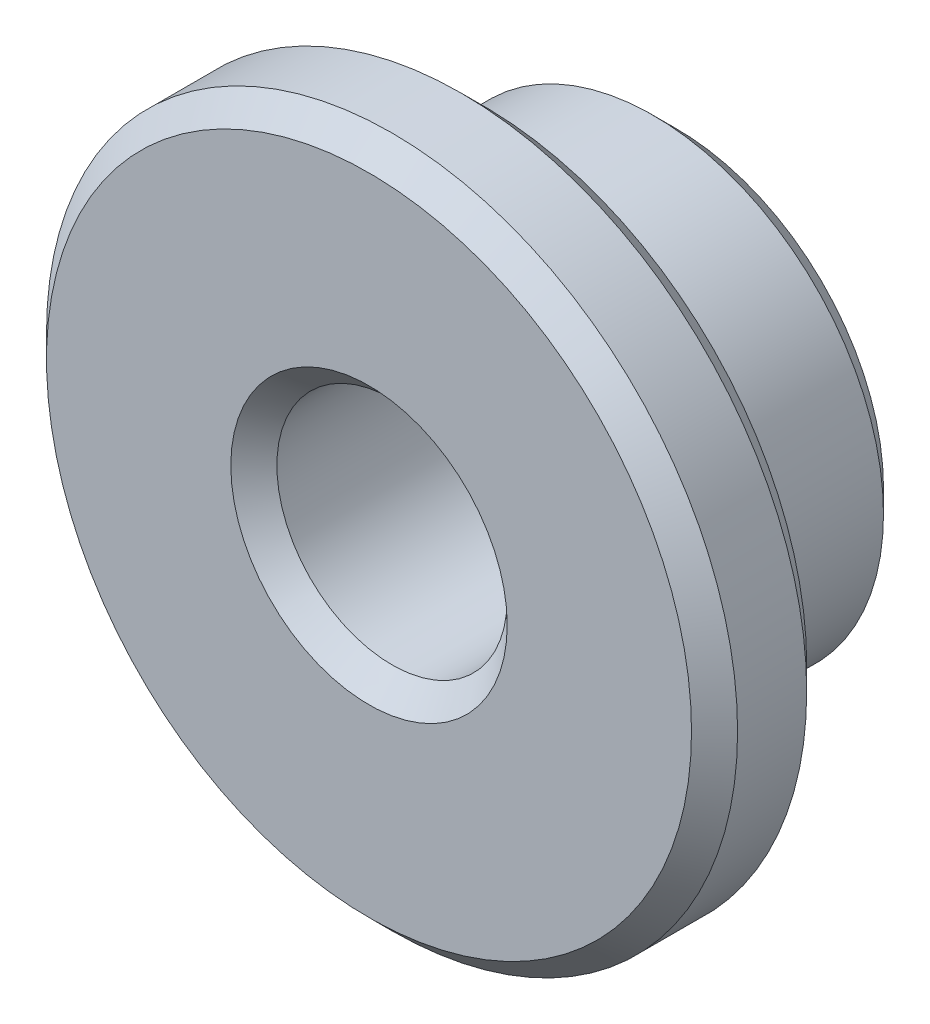
ISO-10303-21;
HEADER;
FILE_DESCRIPTION(('STEP AP214'),'2;1');
FILE_NAME('part.step','',(''),(''),'','','');
FILE_SCHEMA(('AUTOMOTIVE_DESIGN { 1 0 10303 214 1 1 1 1 }'));
ENDSEC;
DATA;
#1=APPLICATION_CONTEXT('core data for automotive mechanical design processes');
#2=APPLICATION_PROTOCOL_DEFINITION('international standard','automotive_design',2000,#1);
#3=PRODUCT_CONTEXT('',#1,'mechanical');
#4=PRODUCT('Part','Part','',(#3));
#5=PRODUCT_RELATED_PRODUCT_CATEGORY('part','',(#4));
#6=PRODUCT_DEFINITION_FORMATION('','',#4);
#7=PRODUCT_DEFINITION_CONTEXT('part definition',#1,'design');
#8=PRODUCT_DEFINITION('design','',#6,#7);
#9=PRODUCT_DEFINITION_SHAPE('','',#8);
#10=(LENGTH_UNIT() NAMED_UNIT(*) SI_UNIT(.MILLI.,.METRE.));
#11=(NAMED_UNIT(*) PLANE_ANGLE_UNIT() SI_UNIT($,.RADIAN.));
#12=(NAMED_UNIT(*) SI_UNIT($,.STERADIAN.) SOLID_ANGLE_UNIT());
#13=UNCERTAINTY_MEASURE_WITH_UNIT(LENGTH_MEASURE(1.E-05),#10,'distance_accuracy_value','');
#14=(GEOMETRIC_REPRESENTATION_CONTEXT(3) GLOBAL_UNCERTAINTY_ASSIGNED_CONTEXT((#13)) GLOBAL_UNIT_ASSIGNED_CONTEXT((#10,
#11,#12)) REPRESENTATION_CONTEXT('',''));
#15=CARTESIAN_POINT('',(0.,0.,0.));
#16=DIRECTION('',(0.,0.,1.));
#17=DIRECTION('',(1.,0.,0.));
#18=AXIS2_PLACEMENT_3D('',#15,#16,#17);
#19=CARTESIAN_POINT('',(0.,0.,4.));
#20=DIRECTION('',(0.,0.,-1.));
#21=DIRECTION('',(-1.,0.,0.));
#22=AXIS2_PLACEMENT_3D('',#19,#20,#21);
#23=CYLINDRICAL_SURFACE('',#22,3.);
#24=CARTESIAN_POINT('',(0.,0.,0.300000000000001));
#25=DIRECTION('',(0.,0.,1.));
#26=DIRECTION('',(1.,0.,0.));
#27=AXIS2_PLACEMENT_3D('',#24,#25,#26);
#28=CIRCLE('',#27,3.);
#29=CARTESIAN_POINT('',(3.,0.,0.300000000000001));
#30=VERTEX_POINT('',#29);
#31=EDGE_CURVE('E43',#30,#30,#28,.T.);
#32=ORIENTED_EDGE('',*,*,#31,.T.);
#33=EDGE_LOOP('',(#32));
#34=FACE_BOUND('',#33,.T.);
#35=CARTESIAN_POINT('',(0.,0.,2.05));
#36=DIRECTION('',(0.,0.,1.));
#37=DIRECTION('',(1.,0.,0.));
#38=AXIS2_PLACEMENT_3D('',#35,#36,#37);
#39=CIRCLE('',#38,3.);
#40=CARTESIAN_POINT('',(3.,0.,2.05));
#41=VERTEX_POINT('',#40);
#42=EDGE_CURVE('E66',#41,#41,#39,.F.);
#43=ORIENTED_EDGE('',*,*,#42,.T.);
#44=EDGE_LOOP('',(#43));
#45=FACE_BOUND('',#44,.T.);
#46=ADVANCED_FACE('F29',(#34,#45),#23,.T.);
#47=CARTESIAN_POINT('',(0.,0.,4.));
#48=DIRECTION('',(0.,0.,1.));
#49=DIRECTION('',(1.,0.,0.));
#50=AXIS2_PLACEMENT_3D('',#47,#48,#49);
#51=PLANE('',#50);
#52=CARTESIAN_POINT('',(0.,0.,4.));
#53=DIRECTION('',(0.,0.,1.));
#54=DIRECTION('',(1.,0.,0.));
#55=AXIS2_PLACEMENT_3D('',#52,#53,#54);
#56=CIRCLE('',#55,1.8);
#57=CARTESIAN_POINT('',(1.8,0.,4.));
#58=VERTEX_POINT('',#57);
#59=EDGE_CURVE('E54',#58,#58,#56,.F.);
#60=ORIENTED_EDGE('',*,*,#59,.T.);
#61=EDGE_LOOP('',(#60));
#62=FACE_BOUND('',#61,.T.);
#63=CARTESIAN_POINT('',(0.,0.,4.));
#64=DIRECTION('',(0.,0.,1.));
#65=DIRECTION('',(1.,0.,0.));
#66=AXIS2_PLACEMENT_3D('',#63,#64,#65);
#67=CIRCLE('',#66,4.2);
#68=CARTESIAN_POINT('',(4.2,0.,4.));
#69=VERTEX_POINT('',#68);
#70=EDGE_CURVE('E57',#69,#69,#67,.T.);
#71=ORIENTED_EDGE('',*,*,#70,.T.);
#72=EDGE_LOOP('',(#71));
#73=FACE_BOUND('',#72,.T.);
#74=ADVANCED_FACE('F92',(#62,#73),#51,.T.);
#75=CARTESIAN_POINT('',(0.,0.,0.));
#76=DIRECTION('',(0.,0.,1.));
#77=DIRECTION('',(1.,0.,0.));
#78=AXIS2_PLACEMENT_3D('',#75,#76,#77);
#79=PLANE('',#78);
#80=CARTESIAN_POINT('',(0.,0.,0.));
#81=DIRECTION('',(0.,0.,1.));
#82=DIRECTION('',(1.,0.,0.));
#83=AXIS2_PLACEMENT_3D('',#80,#81,#82);
#84=CIRCLE('',#83,1.8);
#85=CARTESIAN_POINT('',(1.8,0.,0.));
#86=VERTEX_POINT('',#85);
#87=EDGE_CURVE('E48',#86,#86,#84,.T.);
#88=ORIENTED_EDGE('',*,*,#87,.T.);
#89=EDGE_LOOP('',(#88));
#90=FACE_BOUND('',#89,.T.);
#91=CARTESIAN_POINT('',(0.,0.,0.));
#92=DIRECTION('',(0.,0.,1.));
#93=DIRECTION('',(1.,0.,0.));
#94=AXIS2_PLACEMENT_3D('',#91,#92,#93);
#95=CIRCLE('',#94,2.7);
#96=CARTESIAN_POINT('',(2.7,0.,0.));
#97=VERTEX_POINT('',#96);
#98=EDGE_CURVE('E51',#97,#97,#95,.F.);
#99=ORIENTED_EDGE('',*,*,#98,.T.);
#100=EDGE_LOOP('',(#99));
#101=FACE_BOUND('',#100,.T.);
#102=ADVANCED_FACE('F95',(#90,#101),#79,.F.);
#103=CARTESIAN_POINT('',(0.,0.,4.));
#104=DIRECTION('',(0.,0.,-1.));
#105=DIRECTION('',(-1.,0.,0.));
#106=AXIS2_PLACEMENT_3D('',#103,#104,#105);
#107=CYLINDRICAL_SURFACE('',#106,1.5);
#108=CARTESIAN_POINT('',(0.,0.,3.7));
#109=DIRECTION('',(0.,0.,1.));
#110=DIRECTION('',(1.,0.,0.));
#111=AXIS2_PLACEMENT_3D('',#108,#109,#110);
#112=CIRCLE('',#111,1.5);
#113=CARTESIAN_POINT('',(1.5,0.,3.7));
#114=VERTEX_POINT('',#113);
#115=EDGE_CURVE('E60',#114,#114,#112,.T.);
#116=ORIENTED_EDGE('',*,*,#115,.T.);
#117=EDGE_LOOP('',(#116));
#118=FACE_BOUND('',#117,.T.);
#119=CARTESIAN_POINT('',(0.,0.,0.299999999999999));
#120=DIRECTION('',(0.,0.,1.));
#121=DIRECTION('',(1.,0.,0.));
#122=AXIS2_PLACEMENT_3D('',#119,#120,#121);
#123=CIRCLE('',#122,1.5);
#124=CARTESIAN_POINT('',(1.5,0.,0.299999999999999));
#125=VERTEX_POINT('',#124);
#126=EDGE_CURVE('E63',#125,#125,#123,.F.);
#127=ORIENTED_EDGE('',*,*,#126,.T.);
#128=EDGE_LOOP('',(#127));
#129=FACE_BOUND('',#128,.T.);
#130=ADVANCED_FACE('F126',(#118,#129),#107,.F.);
#131=CARTESIAN_POINT('',(0.,0.,2.5));
#132=DIRECTION('',(0.,0.,1.));
#133=DIRECTION('',(1.,0.,0.));
#134=AXIS2_PLACEMENT_3D('',#131,#132,#133);
#135=CYLINDRICAL_SURFACE('',#134,4.5);
#136=CARTESIAN_POINT('',(0.,0.,2.8));
#137=DIRECTION('',(0.,0.,1.));
#138=DIRECTION('',(1.,0.,0.));
#139=AXIS2_PLACEMENT_3D('',#136,#137,#138);
#140=CIRCLE('',#139,4.5);
#141=CARTESIAN_POINT('',(4.5,0.,2.8));
#142=VERTEX_POINT('',#141);
#143=EDGE_CURVE('E35',#142,#142,#140,.T.);
#144=ORIENTED_EDGE('',*,*,#143,.T.);
#145=EDGE_LOOP('',(#144));
#146=FACE_BOUND('',#145,.T.);
#147=CARTESIAN_POINT('',(0.,0.,3.7));
#148=DIRECTION('',(0.,0.,1.));
#149=DIRECTION('',(1.,0.,0.));
#150=AXIS2_PLACEMENT_3D('',#147,#148,#149);
#151=CIRCLE('',#150,4.5);
#152=CARTESIAN_POINT('',(4.5,0.,3.7));
#153=VERTEX_POINT('',#152);
#154=EDGE_CURVE('E39',#153,#153,#151,.F.);
#155=ORIENTED_EDGE('',*,*,#154,.T.);
#156=EDGE_LOOP('',(#155));
#157=FACE_BOUND('',#156,.T.);
#158=ADVANCED_FACE('F88',(#146,#157),#135,.T.);
#159=CARTESIAN_POINT('',(0.,0.,2.5));
#160=DIRECTION('',(0.,0.,1.));
#161=DIRECTION('',(1.,0.,0.));
#162=AXIS2_PLACEMENT_3D('',#159,#160,#161);
#163=PLANE('',#162);
#164=CARTESIAN_POINT('',(0.,0.,2.5));
#165=DIRECTION('',(0.,0.,1.));
#166=DIRECTION('',(1.,0.,0.));
#167=AXIS2_PLACEMENT_3D('',#164,#165,#166);
#168=CIRCLE('',#167,4.2);
#169=CARTESIAN_POINT('',(4.2,0.,2.5));
#170=VERTEX_POINT('',#169);
#171=EDGE_CURVE('E10',#170,#170,#168,.F.);
#172=ORIENTED_EDGE('',*,*,#171,.T.);
#173=EDGE_LOOP('',(#172));
#174=FACE_BOUND('',#173,.T.);
#175=CARTESIAN_POINT('',(0.,0.,2.5));
#176=DIRECTION('',(0.,0.,1.));
#177=DIRECTION('',(1.,0.,0.));
#178=AXIS2_PLACEMENT_3D('',#175,#176,#177);
#179=CIRCLE('',#178,3.45);
#180=CARTESIAN_POINT('',(3.45,0.,2.5));
#181=VERTEX_POINT('',#180);
#182=EDGE_CURVE('E69',#181,#181,#179,.T.);
#183=ORIENTED_EDGE('',*,*,#182,.T.);
#184=EDGE_LOOP('',(#183));
#185=FACE_BOUND('',#184,.T.);
#186=ADVANCED_FACE('F73',(#174,#185),#163,.F.);
#187=CARTESIAN_POINT('',(0.,0.,2.05));
#188=DIRECTION('',(0.,0.,1.));
#189=DIRECTION('',(1.,0.,0.));
#190=AXIS2_PLACEMENT_3D('',#187,#188,#189);
#191=TOROIDAL_SURFACE('',#190,3.45,0.45);
#192=ORIENTED_EDGE('',*,*,#42,.F.);
#193=EDGE_LOOP('',(#192));
#194=FACE_BOUND('',#193,.T.);
#195=ORIENTED_EDGE('',*,*,#182,.F.);
#196=EDGE_LOOP('',(#195));
#197=FACE_BOUND('',#196,.T.);
#198=ADVANCED_FACE('F75',(#194,#197),#191,.F.);
#199=CARTESIAN_POINT('',(0.,0.,3.7));
#200=DIRECTION('',(0.,0.,1.));
#201=DIRECTION('',(1.,0.,0.));
#202=AXIS2_PLACEMENT_3D('',#199,#200,#201);
#203=CONICAL_SURFACE('',#202,1.5,0.785398163397449);
#204=ORIENTED_EDGE('',*,*,#59,.F.);
#205=EDGE_LOOP('',(#204));
#206=FACE_BOUND('',#205,.T.);
#207=ORIENTED_EDGE('',*,*,#115,.F.);
#208=EDGE_LOOP('',(#207));
#209=FACE_BOUND('',#208,.T.);
#210=ADVANCED_FACE('F77',(#206,#209),#203,.F.);
#211=CARTESIAN_POINT('',(0.,0.,0.));
#212=DIRECTION('',(0.,0.,-1.));
#213=DIRECTION('',(-1.,0.,0.));
#214=AXIS2_PLACEMENT_3D('',#211,#212,#213);
#215=CONICAL_SURFACE('',#214,1.8,0.785398163397449);
#216=ORIENTED_EDGE('',*,*,#126,.F.);
#217=EDGE_LOOP('',(#216));
#218=FACE_BOUND('',#217,.T.);
#219=ORIENTED_EDGE('',*,*,#87,.F.);
#220=EDGE_LOOP('',(#219));
#221=FACE_BOUND('',#220,.T.);
#222=ADVANCED_FACE('F84',(#218,#221),#215,.F.);
#223=CARTESIAN_POINT('',(0.,0.,0.300000000000001));
#224=DIRECTION('',(0.,0.,1.));
#225=DIRECTION('',(1.,0.,0.));
#226=AXIS2_PLACEMENT_3D('',#223,#224,#225);
#227=CONICAL_SURFACE('',#226,3.,0.78539816339745);
#228=CARTESIAN_POINT('',(2.7,0.,0.));
#229=CARTESIAN_POINT('',(2.703125,0.,0.00312500000000003));
#230=CARTESIAN_POINT('',(2.70625,0.,0.00625000000000004));
#231=CARTESIAN_POINT('',(2.7125,0.,0.0125));
#232=CARTESIAN_POINT('',(2.715625,0.,0.015625));
#233=CARTESIAN_POINT('',(2.721875,0.,0.021875));
#234=CARTESIAN_POINT('',(2.725,0.,0.025));
#235=CARTESIAN_POINT('',(2.73125,0.,0.03125));
#236=CARTESIAN_POINT('',(2.734375,0.,0.034375));
#237=CARTESIAN_POINT('',(2.740625,0.,0.0406250000000001));
#238=CARTESIAN_POINT('',(2.74375,0.,0.0437500000000001));
#239=CARTESIAN_POINT('',(2.75,0.,0.0500000000000001));
#240=CARTESIAN_POINT('',(2.753125,0.,0.0531250000000001));
#241=CARTESIAN_POINT('',(2.759375,0.,0.0593750000000001));
#242=CARTESIAN_POINT('',(2.7625,0.,0.0625000000000001));
#243=CARTESIAN_POINT('',(2.76875,0.,0.0687500000000001));
#244=CARTESIAN_POINT('',(2.771875,0.,0.0718750000000001));
#245=CARTESIAN_POINT('',(2.778125,0.,0.0781250000000002));
#246=CARTESIAN_POINT('',(2.78125,0.,0.0812500000000001));
#247=CARTESIAN_POINT('',(2.7875,0.,0.0875000000000001));
#248=CARTESIAN_POINT('',(2.790625,0.,0.0906250000000002));
#249=CARTESIAN_POINT('',(2.796875,0.,0.0968750000000002));
#250=CARTESIAN_POINT('',(2.8,0.,0.1));
#251=CARTESIAN_POINT('',(2.80625,0.,0.10625));
#252=CARTESIAN_POINT('',(2.809375,0.,0.109375));
#253=CARTESIAN_POINT('',(2.815625,0.,0.115625));
#254=CARTESIAN_POINT('',(2.81875,0.,0.11875));
#255=CARTESIAN_POINT('',(2.825,0.,0.125));
#256=CARTESIAN_POINT('',(2.828125,0.,0.128125));
#257=CARTESIAN_POINT('',(2.834375,0.,0.134375));
#258=CARTESIAN_POINT('',(2.8375,0.,0.1375));
#259=CARTESIAN_POINT('',(2.84375,0.,0.14375));
#260=CARTESIAN_POINT('',(2.846875,0.,0.146875));
#261=CARTESIAN_POINT('',(2.853125,0.,0.153125));
#262=CARTESIAN_POINT('',(2.85625,0.,0.15625));
#263=CARTESIAN_POINT('',(2.8625,0.,0.1625));
#264=CARTESIAN_POINT('',(2.865625,0.,0.165625));
#265=CARTESIAN_POINT('',(2.871875,0.,0.171875));
#266=CARTESIAN_POINT('',(2.875,0.,0.175));
#267=CARTESIAN_POINT('',(2.88125,0.,0.18125));
#268=CARTESIAN_POINT('',(2.884375,0.,0.184375));
#269=CARTESIAN_POINT('',(2.890625,0.,0.190625));
#270=CARTESIAN_POINT('',(2.89375,0.,0.19375));
#271=CARTESIAN_POINT('',(2.9,0.,0.2));
#272=CARTESIAN_POINT('',(2.903125,0.,0.203125));
#273=CARTESIAN_POINT('',(2.909375,0.,0.209375));
#274=CARTESIAN_POINT('',(2.9125,0.,0.212500000000001));
#275=CARTESIAN_POINT('',(2.91875,0.,0.218750000000001));
#276=CARTESIAN_POINT('',(2.921875,0.,0.221875));
#277=CARTESIAN_POINT('',(2.928125,0.,0.228125000000001));
#278=CARTESIAN_POINT('',(2.93125,0.,0.231250000000001));
#279=CARTESIAN_POINT('',(2.9375,0.,0.237500000000001));
#280=CARTESIAN_POINT('',(2.940625,0.,0.240625000000001));
#281=CARTESIAN_POINT('',(2.946875,0.,0.246875000000001));
#282=CARTESIAN_POINT('',(2.95,0.,0.250000000000001));
#283=CARTESIAN_POINT('',(2.95625,0.,0.256250000000001));
#284=CARTESIAN_POINT('',(2.959375,0.,0.259375000000001));
#285=CARTESIAN_POINT('',(2.965625,0.,0.265625000000001));
#286=CARTESIAN_POINT('',(2.96875,0.,0.268750000000001));
#287=CARTESIAN_POINT('',(2.975,0.,0.275000000000001));
#288=CARTESIAN_POINT('',(2.978125,0.,0.278125000000001));
#289=CARTESIAN_POINT('',(2.984375,0.,0.284375000000001));
#290=CARTESIAN_POINT('',(2.9875,0.,0.287500000000001));
#291=CARTESIAN_POINT('',(2.99375,0.,0.293750000000001));
#292=CARTESIAN_POINT('',(2.996875,0.,0.296875000000001));
#293=CARTESIAN_POINT('',(3.,0.,0.300000000000001));
#294=B_SPLINE_CURVE_WITH_KNOTS('',3,(#228,#229,#230,#231,#232,#233,#234,#235,#236,#237,#238,
#239,#240,#241,#242,#243,#244,#245,#246,#247,#248,#249,#250,#251,#252,#253,#254,#255,#256,#257,
#258,#259,#260,#261,#262,#263,#264,#265,#266,#267,#268,#269,#270,#271,#272,#273,#274,#275,#276,
#277,#278,#279,#280,#281,#282,#283,#284,#285,#286,#287,#288,#289,#290,#291,#292,#293),
.UNSPECIFIED.,.F.,.F.,(4,2,2,2,2,2,2,2,2,2,2,2,2,2,2,2,2,2,2,2,2,2,2,2,2,2,2,2,2,2,2,2,4),(0.,
0.0132582521472477,0.0265165042944956,0.0397747564417436,0.0530330085889913,0.066291260736239,
0.0795495128834869,0.0928077650307349,0.106066017177983,0.119324269325231,0.132582521472478,
0.145840773619726,0.159099025766974,0.172357277914222,0.185615530061469,0.198873782208717,
0.212132034355965,0.225390286503213,0.238648538650461,0.251906790797709,0.265165042944956,
0.278423295092204,0.291681547239452,0.3049397993867,0.318198051533948,0.331456303681196,
0.344714555828444,0.357972807975691,0.371231060122939,0.384489312270187,0.397747564417435,
0.411005816564683,0.424264068711931),.UNSPECIFIED.);
#295=EDGE_CURVE('BSEAM100',#97,#30,#294,.T.);
#296=ORIENTED_EDGE('',*,*,#98,.F.);
#297=ORIENTED_EDGE('',*,*,#31,.F.);
#298=ORIENTED_EDGE('',*,*,#295,.T.);
#299=ORIENTED_EDGE('',*,*,#295,.F.);
#300=EDGE_LOOP('',(#296,#298,#297,#299));
#301=FACE_BOUND('',#300,.T.);
#302=ADVANCED_FACE('F100',(#301),#227,.T.);
#303=CARTESIAN_POINT('',(0.,0.,2.8));
#304=DIRECTION('',(0.,0.,1.));
#305=DIRECTION('',(1.,0.,0.));
#306=AXIS2_PLACEMENT_3D('',#303,#304,#305);
#307=CONICAL_SURFACE('',#306,4.5,0.78539816339745);
#308=ORIENTED_EDGE('',*,*,#171,.F.);
#309=EDGE_LOOP('',(#308));
#310=FACE_BOUND('',#309,.T.);
#311=ORIENTED_EDGE('',*,*,#143,.F.);
#312=EDGE_LOOP('',(#311));
#313=FACE_BOUND('',#312,.T.);
#314=ADVANCED_FACE('F102',(#310,#313),#307,.T.);
#315=CARTESIAN_POINT('',(0.,0.,4.));
#316=DIRECTION('',(0.,0.,-1.));
#317=DIRECTION('',(-1.,0.,0.));
#318=AXIS2_PLACEMENT_3D('',#315,#316,#317);
#319=CONICAL_SURFACE('',#318,4.2,0.78539816339745);
#320=ORIENTED_EDGE('',*,*,#154,.F.);
#321=EDGE_LOOP('',(#320));
#322=FACE_BOUND('',#321,.T.);
#323=ORIENTED_EDGE('',*,*,#70,.F.);
#324=EDGE_LOOP('',(#323));
#325=FACE_BOUND('',#324,.T.);
#326=ADVANCED_FACE('F109',(#322,#325),#319,.T.);
#327=CLOSED_SHELL('',(#46,#74,#102,#130,#158,#186,#198,#210,#222,#302,#314,#326));
#328=MANIFOLD_SOLID_BREP('B2',#327);
#329=ADVANCED_BREP_SHAPE_REPRESENTATION('',(#18,#328),#14);
#330=SHAPE_DEFINITION_REPRESENTATION(#9,#329);
ENDSEC;
END-ISO-10303-21;
